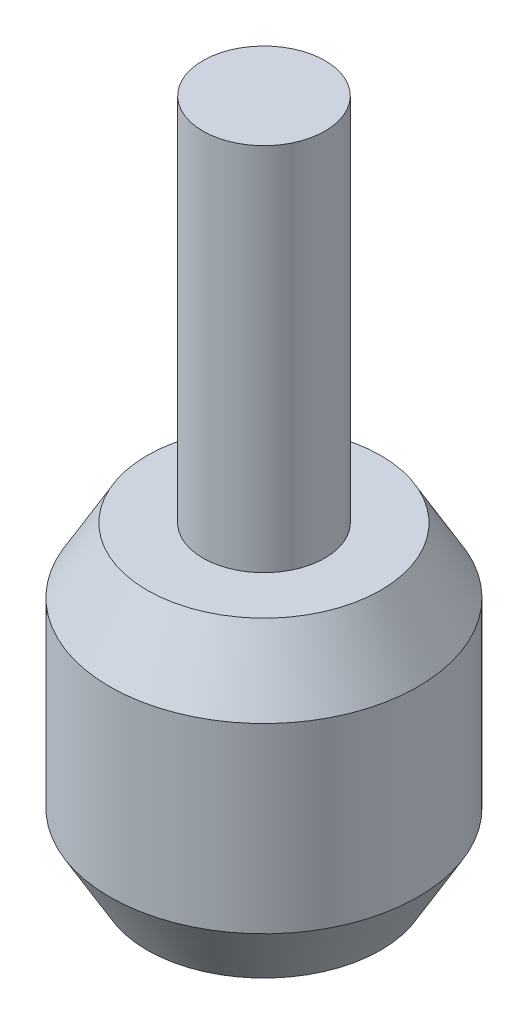
ISO-10303-21;
HEADER;
FILE_DESCRIPTION(('STEP AP214'),'2;1');
FILE_NAME('part.step','',(''),(''),'','','');
FILE_SCHEMA(('AUTOMOTIVE_DESIGN { 1 0 10303 214 1 1 1 1 }'));
ENDSEC;
DATA;
#1=APPLICATION_CONTEXT('core data for automotive mechanical design processes');
#2=APPLICATION_PROTOCOL_DEFINITION('international standard','automotive_design',2000,#1);
#3=PRODUCT_CONTEXT('',#1,'mechanical');
#4=PRODUCT('Part','Part','',(#3));
#5=PRODUCT_RELATED_PRODUCT_CATEGORY('part','',(#4));
#6=PRODUCT_DEFINITION_FORMATION('','',#4);
#7=PRODUCT_DEFINITION_CONTEXT('part definition',#1,'design');
#8=PRODUCT_DEFINITION('design','',#6,#7);
#9=PRODUCT_DEFINITION_SHAPE('','',#8);
#10=(LENGTH_UNIT() NAMED_UNIT(*) SI_UNIT(.MILLI.,.METRE.));
#11=(NAMED_UNIT(*) PLANE_ANGLE_UNIT() SI_UNIT($,.RADIAN.));
#12=(NAMED_UNIT(*) SI_UNIT($,.STERADIAN.) SOLID_ANGLE_UNIT());
#13=UNCERTAINTY_MEASURE_WITH_UNIT(LENGTH_MEASURE(1.E-05),#10,'distance_accuracy_value','');
#14=(GEOMETRIC_REPRESENTATION_CONTEXT(3) GLOBAL_UNCERTAINTY_ASSIGNED_CONTEXT((#13)) GLOBAL_UNIT_ASSIGNED_CONTEXT((#10,
#11,#12)) REPRESENTATION_CONTEXT('',''));
#15=CARTESIAN_POINT('',(0.,0.,0.));
#16=DIRECTION('',(0.,0.,1.));
#17=DIRECTION('',(1.,0.,0.));
#18=AXIS2_PLACEMENT_3D('',#15,#16,#17);
#19=CARTESIAN_POINT('',(0.,0.,0.));
#20=DIRECTION('',(0.,-1.,0.));
#21=DIRECTION('',(0.,0.,-1.));
#22=AXIS2_PLACEMENT_3D('',#19,#20,#21);
#23=PLANE('',#22);
#24=CARTESIAN_POINT('',(0.,0.,0.));
#25=DIRECTION('',(0.,1.,0.));
#26=DIRECTION('',(0.,0.,1.));
#27=AXIS2_PLACEMENT_3D('',#24,#25,#26);
#28=CIRCLE('',#27,4.64804710776936);
#29=CARTESIAN_POINT('',(0.,0.,4.64804710776936));
#30=VERTEX_POINT('',#29);
#31=EDGE_CURVE('E12',#30,#30,#28,.T.);
#32=ORIENTED_EDGE('',*,*,#31,.F.);
#33=EDGE_LOOP('',(#32));
#34=FACE_BOUND('',#33,.T.);
#35=DIRECTION('',(1.,0.,0.));
#36=VECTOR('',#35,1.);
#37=CARTESIAN_POINT('',(-1.83308710467705,0.,3.175));
#38=LINE('',#37,#36);
#39=CARTESIAN_POINT('',(-1.83308710467705,0.,3.175));
#40=VERTEX_POINT('',#39);
#41=CARTESIAN_POINT('',(1.83308710467709,0.,3.175));
#42=VERTEX_POINT('',#41);
#43=EDGE_CURVE('E127',#40,#42,#38,.T.);
#44=ORIENTED_EDGE('',*,*,#43,.T.);
#45=DIRECTION('',(0.499999999999999,0.,-0.866025403784439));
#46=VECTOR('',#45,1.);
#47=CARTESIAN_POINT('',(1.83308710467709,0.,3.175));
#48=LINE('',#47,#46);
#49=CARTESIAN_POINT('',(3.66617420935413,0.,0.));
#50=VERTEX_POINT('',#49);
#51=EDGE_CURVE('E47',#42,#50,#48,.T.);
#52=ORIENTED_EDGE('',*,*,#51,.T.);
#53=DIRECTION('',(-0.499999999999999,0.,-0.866025403784439));
#54=VECTOR('',#53,1.);
#55=CARTESIAN_POINT('',(3.66617420935413,0.,0.));
#56=LINE('',#55,#54);
#57=CARTESIAN_POINT('',(1.83308710467706,0.,-3.175));
#58=VERTEX_POINT('',#57);
#59=EDGE_CURVE('E118',#50,#58,#56,.T.);
#60=ORIENTED_EDGE('',*,*,#59,.T.);
#61=DIRECTION('',(-1.,0.,0.));
#62=VECTOR('',#61,1.);
#63=CARTESIAN_POINT('',(1.83308710467706,0.,-3.175));
#64=LINE('',#63,#62);
#65=CARTESIAN_POINT('',(-1.83308710467705,0.,-3.175));
#66=VERTEX_POINT('',#65);
#67=EDGE_CURVE('E121',#58,#66,#64,.T.);
#68=ORIENTED_EDGE('',*,*,#67,.T.);
#69=DIRECTION('',(-0.5,0.,0.866025403784439));
#70=VECTOR('',#69,1.);
#71=CARTESIAN_POINT('',(-1.83308710467705,0.,-3.175));
#72=LINE('',#71,#70);
#73=CARTESIAN_POINT('',(-3.66617420935412,0.,0.));
#74=VERTEX_POINT('',#73);
#75=EDGE_CURVE('E124',#66,#74,#72,.T.);
#76=ORIENTED_EDGE('',*,*,#75,.T.);
#77=DIRECTION('',(0.5,0.,0.866025403784439));
#78=VECTOR('',#77,1.);
#79=CARTESIAN_POINT('',(-3.66617420935412,0.,0.));
#80=LINE('',#79,#78);
#81=EDGE_CURVE('E108',#74,#40,#80,.T.);
#82=ORIENTED_EDGE('',*,*,#81,.T.);
#83=EDGE_LOOP('',(#44,#52,#60,#68,#76,#82));
#84=FACE_BOUND('',#83,.T.);
#85=ADVANCED_FACE('F33',(#34,#84),#23,.T.);
#86=CARTESIAN_POINT('',(0.,44.6486372541131,0.));
#87=DIRECTION('',(0.,1.,0.));
#88=DIRECTION('',(0.,0.,1.));
#89=AXIS2_PLACEMENT_3D('',#86,#87,#88);
#90=CYLINDRICAL_SURFACE('',#89,4.64804710776936);
#91=ORIENTED_EDGE('',*,*,#31,.T.);
#92=EDGE_LOOP('',(#91));
#93=FACE_BOUND('',#92,.T.);
#94=CARTESIAN_POINT('',(0.,0.405570897008503,0.));
#95=DIRECTION('',(0.,1.,0.));
#96=DIRECTION('',(0.,0.,1.));
#97=AXIS2_PLACEMENT_3D('',#94,#95,#96);
#98=CIRCLE('',#97,4.64804710776936);
#99=CARTESIAN_POINT('',(0.,0.405570897008503,4.64804710776936));
#100=VERTEX_POINT('',#99);
#101=EDGE_CURVE('E40',#100,#100,#98,.T.);
#102=ORIENTED_EDGE('',*,*,#101,.F.);
#103=EDGE_LOOP('',(#102));
#104=FACE_BOUND('',#103,.T.);
#105=ADVANCED_FACE('F167',(#93,#104),#90,.T.);
#106=CARTESIAN_POINT('',(-4.64804710776936,0.405570897008503,0.));
#107=DIRECTION('',(0.,-1.,0.));
#108=DIRECTION('',(0.,0.,-1.));
#109=AXIS2_PLACEMENT_3D('',#106,#107,#108);
#110=PLANE('',#109);
#111=ORIENTED_EDGE('',*,*,#101,.T.);
#112=EDGE_LOOP('',(#111));
#113=FACE_BOUND('',#112,.T.);
#114=CARTESIAN_POINT('',(0.,0.405570897008503,0.));
#115=DIRECTION('',(0.,1.,0.));
#116=DIRECTION('',(0.,0.,1.));
#117=AXIS2_PLACEMENT_3D('',#114,#115,#116);
#118=CIRCLE('',#117,5.21068875797431);
#119=CARTESIAN_POINT('',(0.,0.405570897008503,5.21068875797431));
#120=VERTEX_POINT('',#119);
#121=EDGE_CURVE('E159',#120,#120,#118,.T.);
#122=ORIENTED_EDGE('',*,*,#121,.F.);
#123=EDGE_LOOP('',(#122));
#124=FACE_BOUND('',#123,.T.);
#125=ADVANCED_FACE('F164',(#113,#124),#110,.T.);
#126=CARTESIAN_POINT('',(0.,44.6486372541131,0.));
#127=DIRECTION('',(0.,1.,0.));
#128=DIRECTION('',(0.,0.,1.));
#129=AXIS2_PLACEMENT_3D('',#126,#127,#128);
#130=CYLINDRICAL_SURFACE('',#129,5.21068875797431);
#131=ORIENTED_EDGE('',*,*,#121,.T.);
#132=EDGE_LOOP('',(#131));
#133=FACE_BOUND('',#132,.T.);
#134=CARTESIAN_POINT('',(0.,0.,0.));
#135=DIRECTION('',(0.,1.,0.));
#136=DIRECTION('',(0.,0.,1.));
#137=AXIS2_PLACEMENT_3D('',#134,#135,#136);
#138=CIRCLE('',#137,5.21068875797431);
#139=CARTESIAN_POINT('',(0.,0.,5.21068875797431));
#140=VERTEX_POINT('',#139);
#141=EDGE_CURVE('E156',#140,#140,#138,.T.);
#142=ORIENTED_EDGE('',*,*,#141,.F.);
#143=EDGE_LOOP('',(#142));
#144=FACE_BOUND('',#143,.T.);
#145=ADVANCED_FACE('F174',(#133,#144),#130,.F.);
#146=CARTESIAN_POINT('',(-5.21068875797431,0.,0.));
#147=DIRECTION('',(0.,-1.,0.));
#148=DIRECTION('',(0.,0.,-1.));
#149=AXIS2_PLACEMENT_3D('',#146,#147,#148);
#150=PLANE('',#149);
#151=ORIENTED_EDGE('',*,*,#141,.T.);
#152=EDGE_LOOP('',(#151));
#153=FACE_BOUND('',#152,.T.);
#154=CARTESIAN_POINT('',(0.,0.,0.));
#155=DIRECTION('',(0.,1.,0.));
#156=DIRECTION('',(0.,0.,1.));
#157=AXIS2_PLACEMENT_3D('',#154,#155,#156);
#158=CIRCLE('',#157,7.64982061743338);
#159=CARTESIAN_POINT('',(0.,0.,7.64982061743338));
#160=VERTEX_POINT('',#159);
#161=EDGE_CURVE('E153',#160,#160,#158,.T.);
#162=ORIENTED_EDGE('',*,*,#161,.F.);
#163=EDGE_LOOP('',(#162));
#164=FACE_BOUND('',#163,.T.);
#165=ADVANCED_FACE('F180',(#153,#164),#150,.T.);
#166=CARTESIAN_POINT('',(0.,4.24473953780722,0.));
#167=DIRECTION('',(0.,1.,0.));
#168=DIRECTION('',(0.,0.,1.));
#169=AXIS2_PLACEMENT_3D('',#166,#167,#168);
#170=CONICAL_SURFACE('',#169,10.1005221322262,0.5235987755983);
#171=ORIENTED_EDGE('',*,*,#161,.T.);
#172=EDGE_LOOP('',(#171));
#173=FACE_BOUND('',#172,.T.);
#174=CARTESIAN_POINT('',(0.,4.24473953780722,0.));
#175=DIRECTION('',(0.,1.,0.));
#176=DIRECTION('',(0.,0.,1.));
#177=AXIS2_PLACEMENT_3D('',#174,#175,#176);
#178=CIRCLE('',#177,10.1005221322262);
#179=CARTESIAN_POINT('',(0.,4.24473953780722,10.1005221322262));
#180=VERTEX_POINT('',#179);
#181=EDGE_CURVE('E150',#180,#180,#178,.T.);
#182=ORIENTED_EDGE('',*,*,#181,.F.);
#183=EDGE_LOOP('',(#182));
#184=FACE_BOUND('',#183,.T.);
#185=ADVANCED_FACE('F184',(#173,#184),#170,.T.);
#186=CARTESIAN_POINT('',(0.,44.6486372541131,0.));
#187=DIRECTION('',(0.,1.,0.));
#188=DIRECTION('',(0.,0.,1.));
#189=AXIS2_PLACEMENT_3D('',#186,#187,#188);
#190=CYLINDRICAL_SURFACE('',#189,10.1005221322262);
#191=ORIENTED_EDGE('',*,*,#181,.T.);
#192=EDGE_LOOP('',(#191));
#193=FACE_BOUND('',#192,.T.);
#194=CARTESIAN_POINT('',(0.,16.1767904925047,0.));
#195=DIRECTION('',(0.,1.,0.));
#196=DIRECTION('',(0.,0.,1.));
#197=AXIS2_PLACEMENT_3D('',#194,#195,#196);
#198=CIRCLE('',#197,10.1005221322262);
#199=CARTESIAN_POINT('',(0.,16.1767904925047,10.1005221322262));
#200=VERTEX_POINT('',#199);
#201=EDGE_CURVE('E147',#200,#200,#198,.T.);
#202=ORIENTED_EDGE('',*,*,#201,.F.);
#203=EDGE_LOOP('',(#202));
#204=FACE_BOUND('',#203,.T.);
#205=ADVANCED_FACE('F188',(#193,#204),#190,.T.);
#206=CARTESIAN_POINT('',(0.,20.4215300303119,0.));
#207=DIRECTION('',(0.,-1.,0.));
#208=DIRECTION('',(0.,0.,-1.));
#209=AXIS2_PLACEMENT_3D('',#206,#207,#208);
#210=CONICAL_SURFACE('',#209,7.64982061743338,0.523598775598299);
#211=ORIENTED_EDGE('',*,*,#201,.T.);
#212=EDGE_LOOP('',(#211));
#213=FACE_BOUND('',#212,.T.);
#214=CARTESIAN_POINT('',(0.,20.4215300303119,0.));
#215=DIRECTION('',(0.,1.,0.));
#216=DIRECTION('',(0.,0.,1.));
#217=AXIS2_PLACEMENT_3D('',#214,#215,#216);
#218=CIRCLE('',#217,7.64982061743338);
#219=CARTESIAN_POINT('',(0.,20.4215300303119,7.64982061743338));
#220=VERTEX_POINT('',#219);
#221=EDGE_CURVE('E144',#220,#220,#218,.T.);
#222=ORIENTED_EDGE('',*,*,#221,.F.);
#223=EDGE_LOOP('',(#222));
#224=FACE_BOUND('',#223,.T.);
#225=ADVANCED_FACE('F192',(#213,#224),#210,.T.);
#226=CARTESIAN_POINT('',(-7.64982061743338,20.4215300303119,0.));
#227=DIRECTION('',(0.,1.,0.));
#228=DIRECTION('',(0.,0.,1.));
#229=AXIS2_PLACEMENT_3D('',#226,#227,#228);
#230=PLANE('',#229);
#231=ORIENTED_EDGE('',*,*,#221,.T.);
#232=EDGE_LOOP('',(#231));
#233=FACE_BOUND('',#232,.T.);
#234=CARTESIAN_POINT('',(0.,20.4215300303119,0.));
#235=DIRECTION('',(0.,1.,0.));
#236=DIRECTION('',(0.,0.,1.));
#237=AXIS2_PLACEMENT_3D('',#234,#235,#236);
#238=CIRCLE('',#237,4.);
#239=CARTESIAN_POINT('',(0.,20.4215300303119,4.));
#240=VERTEX_POINT('',#239);
#241=EDGE_CURVE('E141',#240,#240,#238,.T.);
#242=ORIENTED_EDGE('',*,*,#241,.F.);
#243=EDGE_LOOP('',(#242));
#244=FACE_BOUND('',#243,.T.);
#245=ADVANCED_FACE('F196',(#233,#244),#230,.T.);
#246=CARTESIAN_POINT('',(0.,44.6486372541131,0.));
#247=DIRECTION('',(0.,1.,0.));
#248=DIRECTION('',(0.,0.,1.));
#249=AXIS2_PLACEMENT_3D('',#246,#247,#248);
#250=CYLINDRICAL_SURFACE('',#249,4.);
#251=ORIENTED_EDGE('',*,*,#241,.T.);
#252=EDGE_LOOP('',(#251));
#253=FACE_BOUND('',#252,.T.);
#254=CARTESIAN_POINT('',(0.,44.6486372541131,0.));
#255=DIRECTION('',(0.,1.,0.));
#256=DIRECTION('',(0.,0.,1.));
#257=AXIS2_PLACEMENT_3D('',#254,#255,#256);
#258=CIRCLE('',#257,4.);
#259=CARTESIAN_POINT('',(0.,44.6486372541131,4.));
#260=VERTEX_POINT('',#259);
#261=EDGE_CURVE('E138',#260,#260,#258,.T.);
#262=ORIENTED_EDGE('',*,*,#261,.F.);
#263=EDGE_LOOP('',(#262));
#264=FACE_BOUND('',#263,.T.);
#265=ADVANCED_FACE('F200',(#253,#264),#250,.T.);
#266=CARTESIAN_POINT('',(-4.,44.6486372541131,0.));
#267=DIRECTION('',(0.,1.,0.));
#268=DIRECTION('',(0.,0.,1.));
#269=AXIS2_PLACEMENT_3D('',#266,#267,#268);
#270=PLANE('',#269);
#271=ORIENTED_EDGE('',*,*,#261,.T.);
#272=EDGE_LOOP('',(#271));
#273=FACE_BOUND('',#272,.T.);
#274=ADVANCED_FACE('F204',(#273),#270,.T.);
#275=CARTESIAN_POINT('',(1.83308710467709,15.,3.175));
#276=DIRECTION('',(-0.866025403784439,0.,-0.499999999999999));
#277=DIRECTION('',(-0.5,0.,0.866025403784439));
#278=AXIS2_PLACEMENT_3D('',#275,#276,#277);
#279=PLANE('',#278);
#280=ORIENTED_EDGE('',*,*,#51,.F.);
#281=DIRECTION('',(0.,-1.,0.));
#282=VECTOR('',#281,1.);
#283=CARTESIAN_POINT('',(1.83308710467709,15.,3.175));
#284=LINE('',#283,#282);
#285=CARTESIAN_POINT('',(1.83308710467709,15.,3.175));
#286=VERTEX_POINT('',#285);
#287=EDGE_CURVE('E113',#286,#42,#284,.T.);
#288=ORIENTED_EDGE('',*,*,#287,.F.);
#289=DIRECTION('',(0.499999999999999,0.,-0.866025403784439));
#290=VECTOR('',#289,1.);
#291=CARTESIAN_POINT('',(1.83308710467709,15.,3.175));
#292=LINE('',#291,#290);
#293=CARTESIAN_POINT('',(3.66617420935413,15.,0.));
#294=VERTEX_POINT('',#293);
#295=EDGE_CURVE('E130',#286,#294,#292,.T.);
#296=ORIENTED_EDGE('',*,*,#295,.T.);
#297=DIRECTION('',(0.,-1.,0.));
#298=VECTOR('',#297,1.);
#299=CARTESIAN_POINT('',(3.66617420935413,15.,0.));
#300=LINE('',#299,#298);
#301=EDGE_CURVE('E136',#294,#50,#300,.T.);
#302=ORIENTED_EDGE('',*,*,#301,.T.);
#303=EDGE_LOOP('',(#280,#288,#296,#302));
#304=FACE_BOUND('',#303,.T.);
#305=ADVANCED_FACE('F208',(#304),#279,.T.);
#306=CARTESIAN_POINT('',(3.66617420935413,15.,0.));
#307=DIRECTION('',(-0.866025403784439,0.,0.499999999999999));
#308=DIRECTION('',(0.499999999999999,0.,0.86602540378444));
#309=AXIS2_PLACEMENT_3D('',#306,#307,#308);
#310=PLANE('',#309);
#311=ORIENTED_EDGE('',*,*,#59,.F.);
#312=ORIENTED_EDGE('',*,*,#301,.F.);
#313=DIRECTION('',(-0.499999999999999,0.,-0.866025403784439));
#314=VECTOR('',#313,1.);
#315=CARTESIAN_POINT('',(3.66617420935413,15.,0.));
#316=LINE('',#315,#314);
#317=CARTESIAN_POINT('',(1.83308710467706,15.,-3.175));
#318=VERTEX_POINT('',#317);
#319=EDGE_CURVE('E86',#294,#318,#316,.T.);
#320=ORIENTED_EDGE('',*,*,#319,.T.);
#321=DIRECTION('',(0.,-1.,0.));
#322=VECTOR('',#321,1.);
#323=CARTESIAN_POINT('',(1.83308710467706,15.,-3.175));
#324=LINE('',#323,#322);
#325=EDGE_CURVE('E134',#318,#58,#324,.T.);
#326=ORIENTED_EDGE('',*,*,#325,.T.);
#327=EDGE_LOOP('',(#311,#312,#320,#326));
#328=FACE_BOUND('',#327,.T.);
#329=ADVANCED_FACE('F212',(#328),#310,.T.);
#330=CARTESIAN_POINT('',(1.83308710467706,15.,-3.175));
#331=DIRECTION('',(0.,0.,1.));
#332=DIRECTION('',(1.,0.,0.));
#333=AXIS2_PLACEMENT_3D('',#330,#331,#332);
#334=PLANE('',#333);
#335=ORIENTED_EDGE('',*,*,#67,.F.);
#336=ORIENTED_EDGE('',*,*,#325,.F.);
#337=DIRECTION('',(-1.,0.,0.));
#338=VECTOR('',#337,1.);
#339=CARTESIAN_POINT('',(1.83308710467706,15.,-3.175));
#340=LINE('',#339,#338);
#341=CARTESIAN_POINT('',(-1.83308710467705,15.,-3.175));
#342=VERTEX_POINT('',#341);
#343=EDGE_CURVE('E104',#318,#342,#340,.T.);
#344=ORIENTED_EDGE('',*,*,#343,.T.);
#345=DIRECTION('',(0.,-1.,0.));
#346=VECTOR('',#345,1.);
#347=CARTESIAN_POINT('',(-1.83308710467705,15.,-3.175));
#348=LINE('',#347,#346);
#349=EDGE_CURVE('E101',#342,#66,#348,.T.);
#350=ORIENTED_EDGE('',*,*,#349,.T.);
#351=EDGE_LOOP('',(#335,#336,#344,#350));
#352=FACE_BOUND('',#351,.T.);
#353=ADVANCED_FACE('F215',(#352),#334,.T.);
#354=CARTESIAN_POINT('',(-1.83308710467705,15.,-3.175));
#355=DIRECTION('',(0.866025403784439,0.,0.5));
#356=DIRECTION('',(0.5,0.,-0.866025403784439));
#357=AXIS2_PLACEMENT_3D('',#354,#355,#356);
#358=PLANE('',#357);
#359=ORIENTED_EDGE('',*,*,#75,.F.);
#360=ORIENTED_EDGE('',*,*,#349,.F.);
#361=DIRECTION('',(-0.5,0.,0.866025403784439));
#362=VECTOR('',#361,1.);
#363=CARTESIAN_POINT('',(-1.83308710467705,15.,-3.175));
#364=LINE('',#363,#362);
#365=CARTESIAN_POINT('',(-3.66617420935412,15.,0.));
#366=VERTEX_POINT('',#365);
#367=EDGE_CURVE('E96',#342,#366,#364,.T.);
#368=ORIENTED_EDGE('',*,*,#367,.T.);
#369=DIRECTION('',(0.,-1.,0.));
#370=VECTOR('',#369,1.);
#371=CARTESIAN_POINT('',(-3.66617420935412,15.,0.));
#372=LINE('',#371,#370);
#373=EDGE_CURVE('E100',#366,#74,#372,.T.);
#374=ORIENTED_EDGE('',*,*,#373,.T.);
#375=EDGE_LOOP('',(#359,#360,#368,#374));
#376=FACE_BOUND('',#375,.T.);
#377=ADVANCED_FACE('F99',(#376),#358,.T.);
#378=CARTESIAN_POINT('',(-3.66617420935412,15.,0.));
#379=DIRECTION('',(0.866025403784439,0.,-0.499999999999999));
#380=DIRECTION('',(-0.5,0.,-0.866025403784439));
#381=AXIS2_PLACEMENT_3D('',#378,#379,#380);
#382=PLANE('',#381);
#383=ORIENTED_EDGE('',*,*,#81,.F.);
#384=ORIENTED_EDGE('',*,*,#373,.F.);
#385=DIRECTION('',(0.5,0.,0.866025403784439));
#386=VECTOR('',#385,1.);
#387=CARTESIAN_POINT('',(-3.66617420935412,15.,0.));
#388=LINE('',#387,#386);
#389=CARTESIAN_POINT('',(-1.83308710467705,15.,3.175));
#390=VERTEX_POINT('',#389);
#391=EDGE_CURVE('E103',#366,#390,#388,.T.);
#392=ORIENTED_EDGE('',*,*,#391,.T.);
#393=DIRECTION('',(0.,-1.,0.));
#394=VECTOR('',#393,1.);
#395=CARTESIAN_POINT('',(-1.83308710467705,15.,3.175));
#396=LINE('',#395,#394);
#397=EDGE_CURVE('E77',#390,#40,#396,.T.);
#398=ORIENTED_EDGE('',*,*,#397,.T.);
#399=EDGE_LOOP('',(#383,#384,#392,#398));
#400=FACE_BOUND('',#399,.T.);
#401=ADVANCED_FACE('F106',(#400),#382,.T.);
#402=CARTESIAN_POINT('',(-1.83308710467705,15.,3.175));
#403=DIRECTION('',(0.,0.,-1.));
#404=DIRECTION('',(-1.,0.,0.));
#405=AXIS2_PLACEMENT_3D('',#402,#403,#404);
#406=PLANE('',#405);
#407=ORIENTED_EDGE('',*,*,#43,.F.);
#408=ORIENTED_EDGE('',*,*,#397,.F.);
#409=DIRECTION('',(1.,0.,0.));
#410=VECTOR('',#409,1.);
#411=CARTESIAN_POINT('',(-1.83308710467705,15.,3.175));
#412=LINE('',#411,#410);
#413=EDGE_CURVE('E55',#390,#286,#412,.T.);
#414=ORIENTED_EDGE('',*,*,#413,.T.);
#415=ORIENTED_EDGE('',*,*,#287,.T.);
#416=EDGE_LOOP('',(#407,#408,#414,#415));
#417=FACE_BOUND('',#416,.T.);
#418=ADVANCED_FACE('F224',(#417),#406,.T.);
#419=CARTESIAN_POINT('',(0.,15.,0.));
#420=DIRECTION('',(0.,1.,0.));
#421=DIRECTION('',(0.,0.,1.));
#422=AXIS2_PLACEMENT_3D('',#419,#420,#421);
#423=PLANE('',#422);
#424=ORIENTED_EDGE('',*,*,#295,.F.);
#425=ORIENTED_EDGE('',*,*,#413,.F.);
#426=ORIENTED_EDGE('',*,*,#391,.F.);
#427=ORIENTED_EDGE('',*,*,#367,.F.);
#428=ORIENTED_EDGE('',*,*,#343,.F.);
#429=ORIENTED_EDGE('',*,*,#319,.F.);
#430=EDGE_LOOP('',(#424,#425,#426,#427,#428,#429));
#431=FACE_BOUND('',#430,.T.);
#432=ADVANCED_FACE('F111',(#431),#423,.F.);
#433=CLOSED_SHELL('',(#85,#105,#125,#145,#165,#185,#205,#225,#245,#265,#274,#305,#329,#353,#377,
#401,#418,#432));
#434=MANIFOLD_SOLID_BREP('B2',#433);
#435=ADVANCED_BREP_SHAPE_REPRESENTATION('',(#18,#434),#14);
#436=SHAPE_DEFINITION_REPRESENTATION(#9,#435);
ENDSEC;
END-ISO-10303-21;
